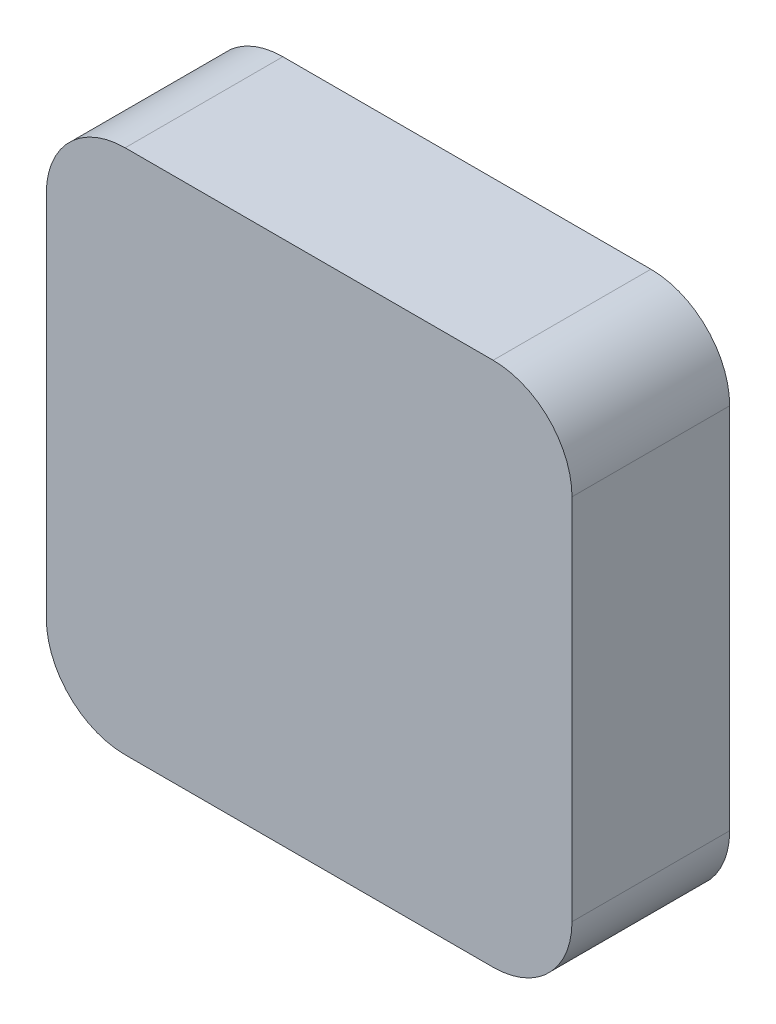
ISO-10303-21;
HEADER;
FILE_DESCRIPTION(('STEP AP214'),'2;1');
FILE_NAME('part.step','',(''),(''),'','','');
FILE_SCHEMA(('AUTOMOTIVE_DESIGN { 1 0 10303 214 1 1 1 1 }'));
ENDSEC;
DATA;
#1=APPLICATION_CONTEXT('core data for automotive mechanical design processes');
#2=APPLICATION_PROTOCOL_DEFINITION('international standard','automotive_design',2000,#1);
#3=PRODUCT_CONTEXT('',#1,'mechanical');
#4=PRODUCT('Part','Part','',(#3));
#5=PRODUCT_RELATED_PRODUCT_CATEGORY('part','',(#4));
#6=PRODUCT_DEFINITION_FORMATION('','',#4);
#7=PRODUCT_DEFINITION_CONTEXT('part definition',#1,'design');
#8=PRODUCT_DEFINITION('design','',#6,#7);
#9=PRODUCT_DEFINITION_SHAPE('','',#8);
#10=(LENGTH_UNIT() NAMED_UNIT(*) SI_UNIT(.MILLI.,.METRE.));
#11=(NAMED_UNIT(*) PLANE_ANGLE_UNIT() SI_UNIT($,.RADIAN.));
#12=(NAMED_UNIT(*) SI_UNIT($,.STERADIAN.) SOLID_ANGLE_UNIT());
#13=UNCERTAINTY_MEASURE_WITH_UNIT(LENGTH_MEASURE(1.E-05),#10,'distance_accuracy_value','');
#14=(GEOMETRIC_REPRESENTATION_CONTEXT(3) GLOBAL_UNCERTAINTY_ASSIGNED_CONTEXT((#13)) GLOBAL_UNIT_ASSIGNED_CONTEXT((#10,
#11,#12)) REPRESENTATION_CONTEXT('',''));
#15=CARTESIAN_POINT('',(0.,0.,0.));
#16=DIRECTION('',(0.,0.,1.));
#17=DIRECTION('',(1.,0.,0.));
#18=AXIS2_PLACEMENT_3D('',#15,#16,#17);
#19=CARTESIAN_POINT('',(-5.,-5.,1.2));
#20=DIRECTION('',(0.,0.,1.));
#21=DIRECTION('',(1.,0.,0.));
#22=AXIS2_PLACEMENT_3D('',#19,#20,#21);
#23=PLANE('',#22);
#24=DIRECTION('',(0.,1.,0.));
#25=VECTOR('',#24,1.);
#26=CARTESIAN_POINT('',(-5.,-5.,1.2));
#27=LINE('',#26,#25);
#28=CARTESIAN_POINT('',(-5.,-3.5,1.2));
#29=VERTEX_POINT('',#28);
#30=CARTESIAN_POINT('',(-5.,3.5,1.2));
#31=VERTEX_POINT('',#30);
#32=EDGE_CURVE('E9',#29,#31,#27,.T.);
#33=ORIENTED_EDGE('',*,*,#32,.F.);
#34=CARTESIAN_POINT('',(-3.5,-3.5,1.2));
#35=DIRECTION('',(0.,0.,1.));
#36=DIRECTION('',(0.,-1.,0.));
#37=AXIS2_PLACEMENT_3D('',#34,#35,#36);
#38=CIRCLE('',#37,1.5);
#39=CARTESIAN_POINT('',(-3.5,-5.,1.2));
#40=VERTEX_POINT('',#39);
#41=EDGE_CURVE('E41',#29,#40,#38,.T.);
#42=ORIENTED_EDGE('',*,*,#41,.T.);
#43=DIRECTION('',(1.,0.,0.));
#44=VECTOR('',#43,1.);
#45=CARTESIAN_POINT('',(-5.,-5.,1.2));
#46=LINE('',#45,#44);
#47=CARTESIAN_POINT('',(3.5,-5.,1.2));
#48=VERTEX_POINT('',#47);
#49=EDGE_CURVE('E466',#40,#48,#46,.T.);
#50=ORIENTED_EDGE('',*,*,#49,.T.);
#51=CARTESIAN_POINT('',(3.5,-3.5,1.2));
#52=DIRECTION('',(0.,0.,1.));
#53=DIRECTION('',(0.,-1.,0.));
#54=AXIS2_PLACEMENT_3D('',#51,#52,#53);
#55=CIRCLE('',#54,1.5);
#56=CARTESIAN_POINT('',(5.,-3.5,1.2));
#57=VERTEX_POINT('',#56);
#58=EDGE_CURVE('E442',#48,#57,#55,.T.);
#59=ORIENTED_EDGE('',*,*,#58,.T.);
#60=DIRECTION('',(0.,1.,0.));
#61=VECTOR('',#60,1.);
#62=CARTESIAN_POINT('',(5.,-5.,1.2));
#63=LINE('',#62,#61);
#64=CARTESIAN_POINT('',(5.,3.5,1.2));
#65=VERTEX_POINT('',#64);
#66=EDGE_CURVE('E570',#57,#65,#63,.T.);
#67=ORIENTED_EDGE('',*,*,#66,.T.);
#68=CARTESIAN_POINT('',(3.5,3.5,1.2));
#69=DIRECTION('',(0.,0.,-1.));
#70=DIRECTION('',(0.,1.,0.));
#71=AXIS2_PLACEMENT_3D('',#68,#69,#70);
#72=CIRCLE('',#71,1.5);
#73=CARTESIAN_POINT('',(3.5,5.,1.2));
#74=VERTEX_POINT('',#73);
#75=EDGE_CURVE('E621',#74,#65,#72,.T.);
#76=ORIENTED_EDGE('',*,*,#75,.F.);
#77=DIRECTION('',(1.,0.,0.));
#78=VECTOR('',#77,1.);
#79=CARTESIAN_POINT('',(-5.,5.,1.2));
#80=LINE('',#79,#78);
#81=CARTESIAN_POINT('',(-3.5,5.,1.2));
#82=VERTEX_POINT('',#81);
#83=EDGE_CURVE('E614',#82,#74,#80,.T.);
#84=ORIENTED_EDGE('',*,*,#83,.F.);
#85=CARTESIAN_POINT('',(-3.5,3.5,1.2));
#86=DIRECTION('',(0.,0.,-1.));
#87=DIRECTION('',(0.,1.,0.));
#88=AXIS2_PLACEMENT_3D('',#85,#86,#87);
#89=CIRCLE('',#88,1.5);
#90=EDGE_CURVE('E582',#31,#82,#89,.T.);
#91=ORIENTED_EDGE('',*,*,#90,.F.);
#92=EDGE_LOOP('',(#33,#42,#50,#59,#67,#76,#84,#91));
#93=FACE_BOUND('',#92,.T.);
#94=ADVANCED_FACE('F15',(#93),#23,.T.);
#95=CARTESIAN_POINT('',(-5.,-5.,0.));
#96=DIRECTION('',(1.,0.,0.));
#97=DIRECTION('',(0.,1.,0.));
#98=AXIS2_PLACEMENT_3D('',#95,#96,#97);
#99=PLANE('',#98);
#100=DIRECTION('',(0.,0.,1.));
#101=VECTOR('',#100,1.);
#102=CARTESIAN_POINT('',(-5.,-3.5,-1.8));
#103=LINE('',#102,#101);
#104=CARTESIAN_POINT('',(-5.,-3.5,-1.8));
#105=VERTEX_POINT('',#104);
#106=EDGE_CURVE('E24',#105,#29,#103,.T.);
#107=ORIENTED_EDGE('',*,*,#106,.T.);
#108=ORIENTED_EDGE('',*,*,#32,.T.);
#109=DIRECTION('',(0.,0.,-1.));
#110=VECTOR('',#109,1.);
#111=CARTESIAN_POINT('',(-5.,3.5,1.2));
#112=LINE('',#111,#110);
#113=CARTESIAN_POINT('',(-5.,3.5,-1.8));
#114=VERTEX_POINT('',#113);
#115=EDGE_CURVE('E611',#31,#114,#112,.T.);
#116=ORIENTED_EDGE('',*,*,#115,.T.);
#117=DIRECTION('',(0.,1.,0.));
#118=VECTOR('',#117,1.);
#119=CARTESIAN_POINT('',(-5.,-5.,-1.8));
#120=LINE('',#119,#118);
#121=EDGE_CURVE('E543',#105,#114,#120,.T.);
#122=ORIENTED_EDGE('',*,*,#121,.F.);
#123=EDGE_LOOP('',(#107,#108,#116,#122));
#124=FACE_BOUND('',#123,.T.);
#125=ADVANCED_FACE('F661',(#124),#99,.F.);
#126=CARTESIAN_POINT('',(-3.5,-3.5,-1.8));
#127=DIRECTION('',(0.,0.,1.));
#128=DIRECTION('',(-1.,0.,0.));
#129=AXIS2_PLACEMENT_3D('',#126,#127,#128);
#130=CYLINDRICAL_SURFACE('',#129,1.5);
#131=CARTESIAN_POINT('',(-3.5,-3.5,-1.8));
#132=DIRECTION('',(0.,0.,1.));
#133=DIRECTION('',(0.,-1.,0.));
#134=AXIS2_PLACEMENT_3D('',#131,#132,#133);
#135=CIRCLE('',#134,1.5);
#136=CARTESIAN_POINT('',(-3.5,-5.,-1.8));
#137=VERTEX_POINT('',#136);
#138=EDGE_CURVE('E494',#105,#137,#135,.T.);
#139=ORIENTED_EDGE('',*,*,#138,.T.);
#140=DIRECTION('',(0.,0.,1.));
#141=VECTOR('',#140,1.);
#142=CARTESIAN_POINT('',(-3.5,-5.,-1.8));
#143=LINE('',#142,#141);
#144=EDGE_CURVE('E344',#137,#40,#143,.T.);
#145=ORIENTED_EDGE('',*,*,#144,.T.);
#146=ORIENTED_EDGE('',*,*,#41,.F.);
#147=ORIENTED_EDGE('',*,*,#106,.F.);
#148=EDGE_LOOP('',(#139,#145,#146,#147));
#149=FACE_BOUND('',#148,.T.);
#150=ADVANCED_FACE('F17',(#149),#130,.T.);
#151=CARTESIAN_POINT('',(-5.,-5.,0.));
#152=DIRECTION('',(0.,1.,0.));
#153=DIRECTION('',(1.,0.,0.));
#154=AXIS2_PLACEMENT_3D('',#151,#152,#153);
#155=PLANE('',#154);
#156=DIRECTION('',(0.,0.,1.));
#157=VECTOR('',#156,1.);
#158=CARTESIAN_POINT('',(3.5,-5.,-1.8));
#159=LINE('',#158,#157);
#160=CARTESIAN_POINT('',(3.5,-5.,-1.8));
#161=VERTEX_POINT('',#160);
#162=EDGE_CURVE('E445',#161,#48,#159,.T.);
#163=ORIENTED_EDGE('',*,*,#162,.T.);
#164=ORIENTED_EDGE('',*,*,#49,.F.);
#165=ORIENTED_EDGE('',*,*,#144,.F.);
#166=DIRECTION('',(1.,0.,0.));
#167=VECTOR('',#166,1.);
#168=CARTESIAN_POINT('',(-5.,-5.,-1.8));
#169=LINE('',#168,#167);
#170=EDGE_CURVE('E490',#137,#161,#169,.T.);
#171=ORIENTED_EDGE('',*,*,#170,.T.);
#172=EDGE_LOOP('',(#163,#164,#165,#171));
#173=FACE_BOUND('',#172,.T.);
#174=ADVANCED_FACE('F637',(#173),#155,.F.);
#175=CARTESIAN_POINT('',(3.5,-3.5,-1.8));
#176=DIRECTION('',(0.,0.,1.));
#177=DIRECTION('',(0.,-1.,0.));
#178=AXIS2_PLACEMENT_3D('',#175,#176,#177);
#179=CYLINDRICAL_SURFACE('',#178,1.5);
#180=CARTESIAN_POINT('',(3.5,-3.5,-1.8));
#181=DIRECTION('',(0.,0.,1.));
#182=DIRECTION('',(0.,-1.,0.));
#183=AXIS2_PLACEMENT_3D('',#180,#181,#182);
#184=CIRCLE('',#183,1.5);
#185=CARTESIAN_POINT('',(5.,-3.5,-1.8));
#186=VERTEX_POINT('',#185);
#187=EDGE_CURVE('E358',#161,#186,#184,.T.);
#188=ORIENTED_EDGE('',*,*,#187,.T.);
#189=DIRECTION('',(0.,0.,1.));
#190=VECTOR('',#189,1.);
#191=CARTESIAN_POINT('',(5.,-3.5,-1.8));
#192=LINE('',#191,#190);
#193=EDGE_CURVE('E446',#186,#57,#192,.T.);
#194=ORIENTED_EDGE('',*,*,#193,.T.);
#195=ORIENTED_EDGE('',*,*,#58,.F.);
#196=ORIENTED_EDGE('',*,*,#162,.F.);
#197=EDGE_LOOP('',(#188,#194,#195,#196));
#198=FACE_BOUND('',#197,.T.);
#199=ADVANCED_FACE('F641',(#198),#179,.T.);
#200=CARTESIAN_POINT('',(5.,-5.,0.));
#201=DIRECTION('',(1.,0.,0.));
#202=DIRECTION('',(0.,1.,0.));
#203=AXIS2_PLACEMENT_3D('',#200,#201,#202);
#204=PLANE('',#203);
#205=DIRECTION('',(0.,1.,0.));
#206=VECTOR('',#205,1.);
#207=CARTESIAN_POINT('',(5.,-5.,-1.8));
#208=LINE('',#207,#206);
#209=CARTESIAN_POINT('',(5.,3.5,-1.8));
#210=VERTEX_POINT('',#209);
#211=EDGE_CURVE('E354',#186,#210,#208,.T.);
#212=ORIENTED_EDGE('',*,*,#211,.T.);
#213=DIRECTION('',(0.,0.,-1.));
#214=VECTOR('',#213,1.);
#215=CARTESIAN_POINT('',(5.,3.5,1.2));
#216=LINE('',#215,#214);
#217=EDGE_CURVE('E573',#65,#210,#216,.T.);
#218=ORIENTED_EDGE('',*,*,#217,.F.);
#219=ORIENTED_EDGE('',*,*,#66,.F.);
#220=ORIENTED_EDGE('',*,*,#193,.F.);
#221=EDGE_LOOP('',(#212,#218,#219,#220));
#222=FACE_BOUND('',#221,.T.);
#223=ADVANCED_FACE('F646',(#222),#204,.T.);
#224=CARTESIAN_POINT('',(3.5,3.5,1.2));
#225=DIRECTION('',(0.,0.,-1.));
#226=DIRECTION('',(0.,1.,0.));
#227=AXIS2_PLACEMENT_3D('',#224,#225,#226);
#228=CYLINDRICAL_SURFACE('',#227,1.5);
#229=ORIENTED_EDGE('',*,*,#75,.T.);
#230=ORIENTED_EDGE('',*,*,#217,.T.);
#231=CARTESIAN_POINT('',(3.5,3.5,-1.8));
#232=DIRECTION('',(0.,0.,-1.));
#233=DIRECTION('',(0.,1.,0.));
#234=AXIS2_PLACEMENT_3D('',#231,#232,#233);
#235=CIRCLE('',#234,1.5);
#236=CARTESIAN_POINT('',(3.5,5.,-1.8));
#237=VERTEX_POINT('',#236);
#238=EDGE_CURVE('E359',#237,#210,#235,.T.);
#239=ORIENTED_EDGE('',*,*,#238,.F.);
#240=DIRECTION('',(0.,0.,-1.));
#241=VECTOR('',#240,1.);
#242=CARTESIAN_POINT('',(3.5,5.,1.2));
#243=LINE('',#242,#241);
#244=EDGE_CURVE('E618',#74,#237,#243,.T.);
#245=ORIENTED_EDGE('',*,*,#244,.F.);
#246=EDGE_LOOP('',(#229,#230,#239,#245));
#247=FACE_BOUND('',#246,.T.);
#248=ADVANCED_FACE('F651',(#247),#228,.T.);
#249=CARTESIAN_POINT('',(-5.,5.,0.));
#250=DIRECTION('',(0.,1.,0.));
#251=DIRECTION('',(1.,0.,0.));
#252=AXIS2_PLACEMENT_3D('',#249,#250,#251);
#253=PLANE('',#252);
#254=DIRECTION('',(1.,0.,0.));
#255=VECTOR('',#254,1.);
#256=CARTESIAN_POINT('',(-5.,5.,-1.8));
#257=LINE('',#256,#255);
#258=CARTESIAN_POINT('',(-3.5,5.,-1.8));
#259=VERTEX_POINT('',#258);
#260=EDGE_CURVE('E450',#259,#237,#257,.T.);
#261=ORIENTED_EDGE('',*,*,#260,.F.);
#262=DIRECTION('',(0.,0.,-1.));
#263=VECTOR('',#262,1.);
#264=CARTESIAN_POINT('',(-3.5,5.,1.2));
#265=LINE('',#264,#263);
#266=EDGE_CURVE('E608',#82,#259,#265,.T.);
#267=ORIENTED_EDGE('',*,*,#266,.F.);
#268=ORIENTED_EDGE('',*,*,#83,.T.);
#269=ORIENTED_EDGE('',*,*,#244,.T.);
#270=EDGE_LOOP('',(#261,#267,#268,#269));
#271=FACE_BOUND('',#270,.T.);
#272=ADVANCED_FACE('F654',(#271),#253,.T.);
#273=CARTESIAN_POINT('',(-3.5,3.5,1.2));
#274=DIRECTION('',(0.,0.,-1.));
#275=DIRECTION('',(-1.,0.,0.));
#276=AXIS2_PLACEMENT_3D('',#273,#274,#275);
#277=CYLINDRICAL_SURFACE('',#276,1.5);
#278=ORIENTED_EDGE('',*,*,#90,.T.);
#279=ORIENTED_EDGE('',*,*,#266,.T.);
#280=CARTESIAN_POINT('',(-3.5,3.5,-1.8));
#281=DIRECTION('',(0.,0.,-1.));
#282=DIRECTION('',(0.,1.,0.));
#283=AXIS2_PLACEMENT_3D('',#280,#281,#282);
#284=CIRCLE('',#283,1.5);
#285=EDGE_CURVE('E454',#114,#259,#284,.T.);
#286=ORIENTED_EDGE('',*,*,#285,.F.);
#287=ORIENTED_EDGE('',*,*,#115,.F.);
#288=EDGE_LOOP('',(#278,#279,#286,#287));
#289=FACE_BOUND('',#288,.T.);
#290=ADVANCED_FACE('F658',(#289),#277,.T.);
#291=CARTESIAN_POINT('',(-0.9,-2.62,-1.8));
#292=DIRECTION('',(0.,0.,1.));
#293=DIRECTION('',(1.,0.,0.));
#294=AXIS2_PLACEMENT_3D('',#291,#292,#293);
#295=PLANE('',#294);
#296=DIRECTION('',(1.,0.,0.));
#297=VECTOR('',#296,1.);
#298=CARTESIAN_POINT('',(-0.9,-1.92,-1.8));
#299=LINE('',#298,#297);
#300=CARTESIAN_POINT('',(-0.9,-1.92,-1.8));
#301=VERTEX_POINT('',#300);
#302=CARTESIAN_POINT('',(0.9,-1.92,-1.8));
#303=VERTEX_POINT('',#302);
#304=EDGE_CURVE('E428',#301,#303,#299,.T.);
#305=ORIENTED_EDGE('',*,*,#304,.T.);
#306=DIRECTION('',(0.,1.,0.));
#307=VECTOR('',#306,1.);
#308=CARTESIAN_POINT('',(0.9,-2.62,-1.8));
#309=LINE('',#308,#307);
#310=CARTESIAN_POINT('',(0.9,-2.62,-1.8));
#311=VERTEX_POINT('',#310);
#312=EDGE_CURVE('E518',#311,#303,#309,.T.);
#313=ORIENTED_EDGE('',*,*,#312,.F.);
#314=DIRECTION('',(1.,0.,0.));
#315=VECTOR('',#314,1.);
#316=CARTESIAN_POINT('',(-0.9,-2.62,-1.8));
#317=LINE('',#316,#315);
#318=CARTESIAN_POINT('',(-0.9,-2.62,-1.8));
#319=VERTEX_POINT('',#318);
#320=EDGE_CURVE('E509',#319,#311,#317,.T.);
#321=ORIENTED_EDGE('',*,*,#320,.F.);
#322=DIRECTION('',(0.,1.,0.));
#323=VECTOR('',#322,1.);
#324=CARTESIAN_POINT('',(-0.9,-2.62,-1.8));
#325=LINE('',#324,#323);
#326=EDGE_CURVE('E427',#319,#301,#325,.T.);
#327=ORIENTED_EDGE('',*,*,#326,.T.);
#328=EDGE_LOOP('',(#305,#313,#321,#327));
#329=FACE_BOUND('',#328,.T.);
#330=ADVANCED_FACE('F773',(#329),#295,.F.);
#331=CARTESIAN_POINT('',(-2.62,-2.4,-1.8));
#332=DIRECTION('',(0.,0.,1.));
#333=DIRECTION('',(1.,0.,0.));
#334=AXIS2_PLACEMENT_3D('',#331,#332,#333);
#335=PLANE('',#334);
#336=DIRECTION('',(1.,0.,0.));
#337=VECTOR('',#336,1.);
#338=CARTESIAN_POINT('',(-2.62,2.4,-1.8));
#339=LINE('',#338,#337);
#340=CARTESIAN_POINT('',(-2.62,2.4,-1.8));
#341=VERTEX_POINT('',#340);
#342=CARTESIAN_POINT('',(-1.92,2.4,-1.8));
#343=VERTEX_POINT('',#342);
#344=EDGE_CURVE('E387',#341,#343,#339,.T.);
#345=ORIENTED_EDGE('',*,*,#344,.T.);
#346=DIRECTION('',(0.,1.,0.));
#347=VECTOR('',#346,1.);
#348=CARTESIAN_POINT('',(-1.92,-2.4,-1.8));
#349=LINE('',#348,#347);
#350=CARTESIAN_POINT('',(-1.92,-2.4,-1.8));
#351=VERTEX_POINT('',#350);
#352=EDGE_CURVE('E388',#351,#343,#349,.T.);
#353=ORIENTED_EDGE('',*,*,#352,.F.);
#354=DIRECTION('',(1.,0.,0.));
#355=VECTOR('',#354,1.);
#356=CARTESIAN_POINT('',(-2.62,-2.4,-1.8));
#357=LINE('',#356,#355);
#358=CARTESIAN_POINT('',(-2.62,-2.4,-1.8));
#359=VERTEX_POINT('',#358);
#360=EDGE_CURVE('E558',#359,#351,#357,.T.);
#361=ORIENTED_EDGE('',*,*,#360,.F.);
#362=DIRECTION('',(0.,1.,0.));
#363=VECTOR('',#362,1.);
#364=CARTESIAN_POINT('',(-2.62,-2.4,-1.8));
#365=LINE('',#364,#363);
#366=EDGE_CURVE('E476',#359,#341,#365,.T.);
#367=ORIENTED_EDGE('',*,*,#366,.T.);
#368=EDGE_LOOP('',(#345,#353,#361,#367));
#369=FACE_BOUND('',#368,.T.);
#370=ADVANCED_FACE('F731',(#369),#335,.F.);
#371=CARTESIAN_POINT('',(1.92,-2.4,-1.8));
#372=DIRECTION('',(0.,0.,1.));
#373=DIRECTION('',(1.,0.,0.));
#374=AXIS2_PLACEMENT_3D('',#371,#372,#373);
#375=PLANE('',#374);
#376=DIRECTION('',(1.,0.,0.));
#377=VECTOR('',#376,1.);
#378=CARTESIAN_POINT('',(1.92,2.4,-1.8));
#379=LINE('',#378,#377);
#380=CARTESIAN_POINT('',(1.92,2.4,-1.8));
#381=VERTEX_POINT('',#380);
#382=CARTESIAN_POINT('',(2.62,2.4,-1.8));
#383=VERTEX_POINT('',#382);
#384=EDGE_CURVE('E585',#381,#383,#379,.T.);
#385=ORIENTED_EDGE('',*,*,#384,.T.);
#386=DIRECTION('',(0.,1.,0.));
#387=VECTOR('',#386,1.);
#388=CARTESIAN_POINT('',(2.62,-2.4,-1.8));
#389=LINE('',#388,#387);
#390=CARTESIAN_POINT('',(2.62,-2.4,-1.8));
#391=VERTEX_POINT('',#390);
#392=EDGE_CURVE('E574',#391,#383,#389,.T.);
#393=ORIENTED_EDGE('',*,*,#392,.F.);
#394=DIRECTION('',(1.,0.,0.));
#395=VECTOR('',#394,1.);
#396=CARTESIAN_POINT('',(1.92,-2.4,-1.8));
#397=LINE('',#396,#395);
#398=CARTESIAN_POINT('',(1.92,-2.4,-1.8));
#399=VERTEX_POINT('',#398);
#400=EDGE_CURVE('E569',#399,#391,#397,.T.);
#401=ORIENTED_EDGE('',*,*,#400,.F.);
#402=DIRECTION('',(0.,1.,0.));
#403=VECTOR('',#402,1.);
#404=CARTESIAN_POINT('',(1.92,-2.4,-1.8));
#405=LINE('',#404,#403);
#406=EDGE_CURVE('E410',#399,#381,#405,.T.);
#407=ORIENTED_EDGE('',*,*,#406,.T.);
#408=EDGE_LOOP('',(#385,#393,#401,#407));
#409=FACE_BOUND('',#408,.T.);
#410=ADVANCED_FACE('F728',(#409),#375,.F.);
#411=CARTESIAN_POINT('',(-0.9,1.92,-1.8));
#412=DIRECTION('',(0.,0.,1.));
#413=DIRECTION('',(1.,0.,0.));
#414=AXIS2_PLACEMENT_3D('',#411,#412,#413);
#415=PLANE('',#414);
#416=DIRECTION('',(1.,0.,0.));
#417=VECTOR('',#416,1.);
#418=CARTESIAN_POINT('',(-0.9,2.62,-1.8));
#419=LINE('',#418,#417);
#420=CARTESIAN_POINT('',(-0.9,2.62,-1.8));
#421=VERTEX_POINT('',#420);
#422=CARTESIAN_POINT('',(0.9,2.62,-1.8));
#423=VERTEX_POINT('',#422);
#424=EDGE_CURVE('E546',#421,#423,#419,.T.);
#425=ORIENTED_EDGE('',*,*,#424,.T.);
#426=DIRECTION('',(0.,1.,0.));
#427=VECTOR('',#426,1.);
#428=CARTESIAN_POINT('',(0.9,1.92,-1.8));
#429=LINE('',#428,#427);
#430=CARTESIAN_POINT('',(0.9,1.92,-1.8));
#431=VERTEX_POINT('',#430);
#432=EDGE_CURVE('E527',#431,#423,#429,.T.);
#433=ORIENTED_EDGE('',*,*,#432,.F.);
#434=DIRECTION('',(1.,0.,0.));
#435=VECTOR('',#434,1.);
#436=CARTESIAN_POINT('',(-0.9,1.92,-1.8));
#437=LINE('',#436,#435);
#438=CARTESIAN_POINT('',(-0.9,1.92,-1.8));
#439=VERTEX_POINT('',#438);
#440=EDGE_CURVE('E523',#439,#431,#437,.T.);
#441=ORIENTED_EDGE('',*,*,#440,.F.);
#442=DIRECTION('',(0.,1.,0.));
#443=VECTOR('',#442,1.);
#444=CARTESIAN_POINT('',(-0.9,1.92,-1.8));
#445=LINE('',#444,#443);
#446=EDGE_CURVE('E554',#439,#421,#445,.T.);
#447=ORIENTED_EDGE('',*,*,#446,.T.);
#448=EDGE_LOOP('',(#425,#433,#441,#447));
#449=FACE_BOUND('',#448,.T.);
#450=ADVANCED_FACE('F697',(#449),#415,.F.);
#451=CARTESIAN_POINT('',(-5.,-5.,-1.8));
#452=DIRECTION('',(0.,0.,1.));
#453=DIRECTION('',(1.,0.,0.));
#454=AXIS2_PLACEMENT_3D('',#451,#452,#453);
#455=PLANE('',#454);
#456=ORIENTED_EDGE('',*,*,#285,.T.);
#457=ORIENTED_EDGE('',*,*,#260,.T.);
#458=ORIENTED_EDGE('',*,*,#238,.T.);
#459=ORIENTED_EDGE('',*,*,#211,.F.);
#460=ORIENTED_EDGE('',*,*,#187,.F.);
#461=ORIENTED_EDGE('',*,*,#170,.F.);
#462=ORIENTED_EDGE('',*,*,#138,.F.);
#463=ORIENTED_EDGE('',*,*,#121,.T.);
#464=EDGE_LOOP('',(#456,#457,#458,#459,#460,#461,#462,#463));
#465=FACE_BOUND('',#464,.T.);
#466=CARTESIAN_POINT('',(2.7,2.7,-1.8));
#467=DIRECTION('',(0.,0.,1.));
#468=DIRECTION('',(0.,-1.,0.));
#469=AXIS2_PLACEMENT_3D('',#466,#467,#468);
#470=CIRCLE('',#469,1.5);
#471=CARTESIAN_POINT('',(4.2,2.7,-1.8));
#472=VERTEX_POINT('',#471);
#473=CARTESIAN_POINT('',(2.7,4.2,-1.8));
#474=VERTEX_POINT('',#473);
#475=EDGE_CURVE('E512',#472,#474,#470,.T.);
#476=ORIENTED_EDGE('',*,*,#475,.T.);
#477=DIRECTION('',(-1.,0.,0.));
#478=VECTOR('',#477,1.);
#479=CARTESIAN_POINT('',(-4.6,4.2,-1.8));
#480=LINE('',#479,#478);
#481=CARTESIAN_POINT('',(-2.7,4.2,-1.8));
#482=VERTEX_POINT('',#481);
#483=EDGE_CURVE('E332',#474,#482,#480,.T.);
#484=ORIENTED_EDGE('',*,*,#483,.T.);
#485=CARTESIAN_POINT('',(-2.7,2.7,-1.8));
#486=DIRECTION('',(0.,0.,1.));
#487=DIRECTION('',(0.,-1.,0.));
#488=AXIS2_PLACEMENT_3D('',#485,#486,#487);
#489=CIRCLE('',#488,1.5);
#490=CARTESIAN_POINT('',(-4.2,2.7,-1.8));
#491=VERTEX_POINT('',#490);
#492=EDGE_CURVE('E486',#482,#491,#489,.T.);
#493=ORIENTED_EDGE('',*,*,#492,.T.);
#494=DIRECTION('',(0.,1.,0.));
#495=VECTOR('',#494,1.);
#496=CARTESIAN_POINT('',(-4.2,-4.6,-1.8));
#497=LINE('',#496,#495);
#498=CARTESIAN_POINT('',(-4.2,-2.7,-1.8));
#499=VERTEX_POINT('',#498);
#500=EDGE_CURVE('E415',#499,#491,#497,.T.);
#501=ORIENTED_EDGE('',*,*,#500,.F.);
#502=CARTESIAN_POINT('',(-2.7,-2.7,-1.8));
#503=DIRECTION('',(0.,0.,1.));
#504=DIRECTION('',(0.,-1.,0.));
#505=AXIS2_PLACEMENT_3D('',#502,#503,#504);
#506=CIRCLE('',#505,1.5);
#507=CARTESIAN_POINT('',(-2.7,-4.2,-1.8));
#508=VERTEX_POINT('',#507);
#509=EDGE_CURVE('E475',#499,#508,#506,.T.);
#510=ORIENTED_EDGE('',*,*,#509,.T.);
#511=DIRECTION('',(-1.,0.,0.));
#512=VECTOR('',#511,1.);
#513=CARTESIAN_POINT('',(-4.6,-4.2,-1.8));
#514=LINE('',#513,#512);
#515=CARTESIAN_POINT('',(2.7,-4.2,-1.8));
#516=VERTEX_POINT('',#515);
#517=EDGE_CURVE('E489',#516,#508,#514,.T.);
#518=ORIENTED_EDGE('',*,*,#517,.F.);
#519=CARTESIAN_POINT('',(2.7,-2.7,-1.8));
#520=DIRECTION('',(0.,0.,-1.));
#521=DIRECTION('',(0.,-1.,0.));
#522=AXIS2_PLACEMENT_3D('',#519,#520,#521);
#523=CIRCLE('',#522,1.5);
#524=CARTESIAN_POINT('',(4.2,-2.7,-1.8));
#525=VERTEX_POINT('',#524);
#526=EDGE_CURVE('E304',#525,#516,#523,.T.);
#527=ORIENTED_EDGE('',*,*,#526,.F.);
#528=DIRECTION('',(0.,1.,0.));
#529=VECTOR('',#528,1.);
#530=CARTESIAN_POINT('',(4.2,-4.6,-1.8));
#531=LINE('',#530,#529);
#532=EDGE_CURVE('E299',#525,#472,#531,.T.);
#533=ORIENTED_EDGE('',*,*,#532,.T.);
#534=EDGE_LOOP('',(#476,#484,#493,#501,#510,#518,#527,#533));
#535=FACE_BOUND('',#534,.T.);
#536=ADVANCED_FACE('F664',(#465,#535),#455,.F.);
#537=CARTESIAN_POINT('',(-0.9,-2.62,-1.8));
#538=DIRECTION('',(1.,0.,0.));
#539=DIRECTION('',(0.,1.,0.));
#540=AXIS2_PLACEMENT_3D('',#537,#538,#539);
#541=PLANE('',#540);
#542=DIRECTION('',(0.,1.,0.));
#543=VECTOR('',#542,1.);
#544=CARTESIAN_POINT('',(-0.9,-2.62,0.));
#545=LINE('',#544,#543);
#546=CARTESIAN_POINT('',(-0.9,-2.62,0.));
#547=VERTEX_POINT('',#546);
#548=CARTESIAN_POINT('',(-0.9,-1.92,0.));
#549=VERTEX_POINT('',#548);
#550=EDGE_CURVE('E420',#547,#549,#545,.T.);
#551=ORIENTED_EDGE('',*,*,#550,.T.);
#552=DIRECTION('',(0.,0.,1.));
#553=VECTOR('',#552,1.);
#554=CARTESIAN_POINT('',(-0.9,-1.92,-1.8));
#555=LINE('',#554,#553);
#556=EDGE_CURVE('E424',#301,#549,#555,.T.);
#557=ORIENTED_EDGE('',*,*,#556,.F.);
#558=ORIENTED_EDGE('',*,*,#326,.F.);
#559=DIRECTION('',(0.,0.,1.));
#560=VECTOR('',#559,1.);
#561=CARTESIAN_POINT('',(-0.9,-2.62,-1.8));
#562=LINE('',#561,#560);
#563=EDGE_CURVE('E506',#319,#547,#562,.T.);
#564=ORIENTED_EDGE('',*,*,#563,.T.);
#565=EDGE_LOOP('',(#551,#557,#558,#564));
#566=FACE_BOUND('',#565,.T.);
#567=ADVANCED_FACE('F696',(#566),#541,.F.);
#568=CARTESIAN_POINT('',(-0.9,-1.92,-1.8));
#569=DIRECTION('',(0.,1.,0.));
#570=DIRECTION('',(1.,0.,0.));
#571=AXIS2_PLACEMENT_3D('',#568,#569,#570);
#572=PLANE('',#571);
#573=ORIENTED_EDGE('',*,*,#304,.F.);
#574=ORIENTED_EDGE('',*,*,#556,.T.);
#575=DIRECTION('',(1.,0.,0.));
#576=VECTOR('',#575,1.);
#577=CARTESIAN_POINT('',(-0.9,-1.92,0.));
#578=LINE('',#577,#576);
#579=CARTESIAN_POINT('',(0.9,-1.92,0.));
#580=VERTEX_POINT('',#579);
#581=EDGE_CURVE('E438',#549,#580,#578,.T.);
#582=ORIENTED_EDGE('',*,*,#581,.T.);
#583=DIRECTION('',(0.,0.,1.));
#584=VECTOR('',#583,1.);
#585=CARTESIAN_POINT('',(0.9,-1.92,-1.8));
#586=LINE('',#585,#584);
#587=EDGE_CURVE('E522',#303,#580,#586,.T.);
#588=ORIENTED_EDGE('',*,*,#587,.F.);
#589=EDGE_LOOP('',(#573,#574,#582,#588));
#590=FACE_BOUND('',#589,.T.);
#591=ADVANCED_FACE('F763',(#590),#572,.T.);
#592=CARTESIAN_POINT('',(0.9,-2.62,-1.8));
#593=DIRECTION('',(1.,0.,0.));
#594=DIRECTION('',(0.,1.,0.));
#595=AXIS2_PLACEMENT_3D('',#592,#593,#594);
#596=PLANE('',#595);
#597=DIRECTION('',(0.,0.,1.));
#598=VECTOR('',#597,1.);
#599=CARTESIAN_POINT('',(0.9,-2.62,-1.8));
#600=LINE('',#599,#598);
#601=CARTESIAN_POINT('',(0.9,-2.62,0.));
#602=VERTEX_POINT('',#601);
#603=EDGE_CURVE('E479',#311,#602,#600,.T.);
#604=ORIENTED_EDGE('',*,*,#603,.F.);
#605=ORIENTED_EDGE('',*,*,#312,.T.);
#606=ORIENTED_EDGE('',*,*,#587,.T.);
#607=DIRECTION('',(0.,1.,0.));
#608=VECTOR('',#607,1.);
#609=CARTESIAN_POINT('',(0.9,-2.62,0.));
#610=LINE('',#609,#608);
#611=EDGE_CURVE('E403',#602,#580,#610,.T.);
#612=ORIENTED_EDGE('',*,*,#611,.F.);
#613=EDGE_LOOP('',(#604,#605,#606,#612));
#614=FACE_BOUND('',#613,.T.);
#615=ADVANCED_FACE('F759',(#614),#596,.T.);
#616=CARTESIAN_POINT('',(-0.9,-2.62,-1.8));
#617=DIRECTION('',(0.,1.,0.));
#618=DIRECTION('',(1.,0.,0.));
#619=AXIS2_PLACEMENT_3D('',#616,#617,#618);
#620=PLANE('',#619);
#621=ORIENTED_EDGE('',*,*,#603,.T.);
#622=DIRECTION('',(1.,0.,0.));
#623=VECTOR('',#622,1.);
#624=CARTESIAN_POINT('',(-0.9,-2.62,0.));
#625=LINE('',#624,#623);
#626=EDGE_CURVE('E399',#547,#602,#625,.T.);
#627=ORIENTED_EDGE('',*,*,#626,.F.);
#628=ORIENTED_EDGE('',*,*,#563,.F.);
#629=ORIENTED_EDGE('',*,*,#320,.T.);
#630=EDGE_LOOP('',(#621,#627,#628,#629));
#631=FACE_BOUND('',#630,.T.);
#632=ADVANCED_FACE('F755',(#631),#620,.F.);
#633=CARTESIAN_POINT('',(-2.62,-2.4,-1.8));
#634=DIRECTION('',(1.,0.,0.));
#635=DIRECTION('',(0.,1.,0.));
#636=AXIS2_PLACEMENT_3D('',#633,#634,#635);
#637=PLANE('',#636);
#638=DIRECTION('',(0.,1.,0.));
#639=VECTOR('',#638,1.);
#640=CARTESIAN_POINT('',(-2.62,-2.4,0.));
#641=LINE('',#640,#639);
#642=CARTESIAN_POINT('',(-2.62,-2.4,0.));
#643=VERTEX_POINT('',#642);
#644=CARTESIAN_POINT('',(-2.62,2.4,0.));
#645=VERTEX_POINT('',#644);
#646=EDGE_CURVE('E393',#643,#645,#641,.T.);
#647=ORIENTED_EDGE('',*,*,#646,.T.);
#648=DIRECTION('',(0.,0.,1.));
#649=VECTOR('',#648,1.);
#650=CARTESIAN_POINT('',(-2.62,2.4,-1.8));
#651=LINE('',#650,#649);
#652=EDGE_CURVE('E460',#341,#645,#651,.T.);
#653=ORIENTED_EDGE('',*,*,#652,.F.);
#654=ORIENTED_EDGE('',*,*,#366,.F.);
#655=DIRECTION('',(0.,0.,1.));
#656=VECTOR('',#655,1.);
#657=CARTESIAN_POINT('',(-2.62,-2.4,-1.8));
#658=LINE('',#657,#656);
#659=EDGE_CURVE('E594',#359,#643,#658,.T.);
#660=ORIENTED_EDGE('',*,*,#659,.T.);
#661=EDGE_LOOP('',(#647,#653,#654,#660));
#662=FACE_BOUND('',#661,.T.);
#663=ADVANCED_FACE('F751',(#662),#637,.F.);
#664=CARTESIAN_POINT('',(-2.62,2.4,-1.8));
#665=DIRECTION('',(0.,1.,0.));
#666=DIRECTION('',(1.,0.,0.));
#667=AXIS2_PLACEMENT_3D('',#664,#665,#666);
#668=PLANE('',#667);
#669=ORIENTED_EDGE('',*,*,#344,.F.);
#670=ORIENTED_EDGE('',*,*,#652,.T.);
#671=DIRECTION('',(1.,0.,0.));
#672=VECTOR('',#671,1.);
#673=CARTESIAN_POINT('',(-2.62,2.4,0.));
#674=LINE('',#673,#672);
#675=CARTESIAN_POINT('',(-1.92,2.4,0.));
#676=VERTEX_POINT('',#675);
#677=EDGE_CURVE('E389',#645,#676,#674,.T.);
#678=ORIENTED_EDGE('',*,*,#677,.T.);
#679=DIRECTION('',(0.,0.,1.));
#680=VECTOR('',#679,1.);
#681=CARTESIAN_POINT('',(-1.92,2.4,-1.8));
#682=LINE('',#681,#680);
#683=EDGE_CURVE('E384',#343,#676,#682,.T.);
#684=ORIENTED_EDGE('',*,*,#683,.F.);
#685=EDGE_LOOP('',(#669,#670,#678,#684));
#686=FACE_BOUND('',#685,.T.);
#687=ADVANCED_FACE('F747',(#686),#668,.T.);
#688=CARTESIAN_POINT('',(-1.92,-2.4,-1.8));
#689=DIRECTION('',(1.,0.,0.));
#690=DIRECTION('',(0.,1.,0.));
#691=AXIS2_PLACEMENT_3D('',#688,#689,#690);
#692=PLANE('',#691);
#693=DIRECTION('',(0.,0.,1.));
#694=VECTOR('',#693,1.);
#695=CARTESIAN_POINT('',(-1.92,-2.4,-1.8));
#696=LINE('',#695,#694);
#697=CARTESIAN_POINT('',(-1.92,-2.4,0.));
#698=VERTEX_POINT('',#697);
#699=EDGE_CURVE('E413',#351,#698,#696,.T.);
#700=ORIENTED_EDGE('',*,*,#699,.F.);
#701=ORIENTED_EDGE('',*,*,#352,.T.);
#702=ORIENTED_EDGE('',*,*,#683,.T.);
#703=DIRECTION('',(0.,1.,0.));
#704=VECTOR('',#703,1.);
#705=CARTESIAN_POINT('',(-1.92,-2.4,0.));
#706=LINE('',#705,#704);
#707=EDGE_CURVE('E394',#698,#676,#706,.T.);
#708=ORIENTED_EDGE('',*,*,#707,.F.);
#709=EDGE_LOOP('',(#700,#701,#702,#708));
#710=FACE_BOUND('',#709,.T.);
#711=ADVANCED_FACE('F743',(#710),#692,.T.);
#712=CARTESIAN_POINT('',(-2.62,-2.4,-1.8));
#713=DIRECTION('',(0.,1.,0.));
#714=DIRECTION('',(1.,0.,0.));
#715=AXIS2_PLACEMENT_3D('',#712,#713,#714);
#716=PLANE('',#715);
#717=ORIENTED_EDGE('',*,*,#699,.T.);
#718=DIRECTION('',(1.,0.,0.));
#719=VECTOR('',#718,1.);
#720=CARTESIAN_POINT('',(-2.62,-2.4,0.));
#721=LINE('',#720,#719);
#722=EDGE_CURVE('E348',#643,#698,#721,.T.);
#723=ORIENTED_EDGE('',*,*,#722,.F.);
#724=ORIENTED_EDGE('',*,*,#659,.F.);
#725=ORIENTED_EDGE('',*,*,#360,.T.);
#726=EDGE_LOOP('',(#717,#723,#724,#725));
#727=FACE_BOUND('',#726,.T.);
#728=ADVANCED_FACE('F746',(#727),#716,.F.);
#729=CARTESIAN_POINT('',(1.92,-2.4,-1.8));
#730=DIRECTION('',(1.,0.,0.));
#731=DIRECTION('',(0.,1.,0.));
#732=AXIS2_PLACEMENT_3D('',#729,#730,#731);
#733=PLANE('',#732);
#734=DIRECTION('',(0.,1.,0.));
#735=VECTOR('',#734,1.);
#736=CARTESIAN_POINT('',(1.92,-2.4,0.));
#737=LINE('',#736,#735);
#738=CARTESIAN_POINT('',(1.92,-2.4,0.));
#739=VERTEX_POINT('',#738);
#740=CARTESIAN_POINT('',(1.92,2.4,0.));
#741=VERTEX_POINT('',#740);
#742=EDGE_CURVE('E345',#739,#741,#737,.T.);
#743=ORIENTED_EDGE('',*,*,#742,.T.);
#744=DIRECTION('',(0.,0.,1.));
#745=VECTOR('',#744,1.);
#746=CARTESIAN_POINT('',(1.92,2.4,-1.8));
#747=LINE('',#746,#745);
#748=EDGE_CURVE('E414',#381,#741,#747,.T.);
#749=ORIENTED_EDGE('',*,*,#748,.F.);
#750=ORIENTED_EDGE('',*,*,#406,.F.);
#751=DIRECTION('',(0.,0.,1.));
#752=VECTOR('',#751,1.);
#753=CARTESIAN_POINT('',(1.92,-2.4,-1.8));
#754=LINE('',#753,#752);
#755=EDGE_CURVE('E566',#399,#739,#754,.T.);
#756=ORIENTED_EDGE('',*,*,#755,.T.);
#757=EDGE_LOOP('',(#743,#749,#750,#756));
#758=FACE_BOUND('',#757,.T.);
#759=ADVANCED_FACE('F741',(#758),#733,.F.);
#760=CARTESIAN_POINT('',(1.92,2.4,-1.8));
#761=DIRECTION('',(0.,1.,0.));
#762=DIRECTION('',(1.,0.,0.));
#763=AXIS2_PLACEMENT_3D('',#760,#761,#762);
#764=PLANE('',#763);
#765=ORIENTED_EDGE('',*,*,#384,.F.);
#766=ORIENTED_EDGE('',*,*,#748,.T.);
#767=DIRECTION('',(1.,0.,0.));
#768=VECTOR('',#767,1.);
#769=CARTESIAN_POINT('',(1.92,2.4,0.));
#770=LINE('',#769,#768);
#771=CARTESIAN_POINT('',(2.62,2.4,0.));
#772=VERTEX_POINT('',#771);
#773=EDGE_CURVE('E349',#741,#772,#770,.T.);
#774=ORIENTED_EDGE('',*,*,#773,.T.);
#775=DIRECTION('',(0.,0.,1.));
#776=VECTOR('',#775,1.);
#777=CARTESIAN_POINT('',(2.62,2.4,-1.8));
#778=LINE('',#777,#776);
#779=EDGE_CURVE('E578',#383,#772,#778,.T.);
#780=ORIENTED_EDGE('',*,*,#779,.F.);
#781=EDGE_LOOP('',(#765,#766,#774,#780));
#782=FACE_BOUND('',#781,.T.);
#783=ADVANCED_FACE('F735',(#782),#764,.T.);
#784=CARTESIAN_POINT('',(2.62,-2.4,-1.8));
#785=DIRECTION('',(1.,0.,0.));
#786=DIRECTION('',(0.,1.,0.));
#787=AXIS2_PLACEMENT_3D('',#784,#785,#786);
#788=PLANE('',#787);
#789=DIRECTION('',(0.,0.,1.));
#790=VECTOR('',#789,1.);
#791=CARTESIAN_POINT('',(2.62,-2.4,-1.8));
#792=LINE('',#791,#790);
#793=CARTESIAN_POINT('',(2.62,-2.4,0.));
#794=VERTEX_POINT('',#793);
#795=EDGE_CURVE('E561',#391,#794,#792,.T.);
#796=ORIENTED_EDGE('',*,*,#795,.F.);
#797=ORIENTED_EDGE('',*,*,#392,.T.);
#798=ORIENTED_EDGE('',*,*,#779,.T.);
#799=DIRECTION('',(0.,1.,0.));
#800=VECTOR('',#799,1.);
#801=CARTESIAN_POINT('',(2.62,-2.4,0.));
#802=LINE('',#801,#800);
#803=EDGE_CURVE('E398',#794,#772,#802,.T.);
#804=ORIENTED_EDGE('',*,*,#803,.F.);
#805=EDGE_LOOP('',(#796,#797,#798,#804));
#806=FACE_BOUND('',#805,.T.);
#807=ADVANCED_FACE('F686',(#806),#788,.T.);
#808=CARTESIAN_POINT('',(1.92,-2.4,-1.8));
#809=DIRECTION('',(0.,1.,0.));
#810=DIRECTION('',(1.,0.,0.));
#811=AXIS2_PLACEMENT_3D('',#808,#809,#810);
#812=PLANE('',#811);
#813=ORIENTED_EDGE('',*,*,#795,.T.);
#814=DIRECTION('',(1.,0.,0.));
#815=VECTOR('',#814,1.);
#816=CARTESIAN_POINT('',(1.92,-2.4,0.));
#817=LINE('',#816,#815);
#818=EDGE_CURVE('E377',#739,#794,#817,.T.);
#819=ORIENTED_EDGE('',*,*,#818,.F.);
#820=ORIENTED_EDGE('',*,*,#755,.F.);
#821=ORIENTED_EDGE('',*,*,#400,.T.);
#822=EDGE_LOOP('',(#813,#819,#820,#821));
#823=FACE_BOUND('',#822,.T.);
#824=ADVANCED_FACE('F682',(#823),#812,.F.);
#825=CARTESIAN_POINT('',(-0.9,1.92,-1.8));
#826=DIRECTION('',(1.,0.,0.));
#827=DIRECTION('',(0.,1.,0.));
#828=AXIS2_PLACEMENT_3D('',#825,#826,#827);
#829=PLANE('',#828);
#830=DIRECTION('',(0.,1.,0.));
#831=VECTOR('',#830,1.);
#832=CARTESIAN_POINT('',(-0.9,1.92,0.));
#833=LINE('',#832,#831);
#834=CARTESIAN_POINT('',(-0.9,1.92,0.));
#835=VERTEX_POINT('',#834);
#836=CARTESIAN_POINT('',(-0.9,2.62,0.));
#837=VERTEX_POINT('',#836);
#838=EDGE_CURVE('E373',#835,#837,#833,.T.);
#839=ORIENTED_EDGE('',*,*,#838,.T.);
#840=DIRECTION('',(0.,0.,1.));
#841=VECTOR('',#840,1.);
#842=CARTESIAN_POINT('',(-0.9,2.62,-1.8));
#843=LINE('',#842,#841);
#844=EDGE_CURVE('E551',#421,#837,#843,.T.);
#845=ORIENTED_EDGE('',*,*,#844,.F.);
#846=ORIENTED_EDGE('',*,*,#446,.F.);
#847=DIRECTION('',(0.,0.,1.));
#848=VECTOR('',#847,1.);
#849=CARTESIAN_POINT('',(-0.9,1.92,-1.8));
#850=LINE('',#849,#848);
#851=EDGE_CURVE('E528',#439,#835,#850,.T.);
#852=ORIENTED_EDGE('',*,*,#851,.T.);
#853=EDGE_LOOP('',(#839,#845,#846,#852));
#854=FACE_BOUND('',#853,.T.);
#855=ADVANCED_FACE('F685',(#854),#829,.F.);
#856=CARTESIAN_POINT('',(-0.9,2.62,-1.8));
#857=DIRECTION('',(0.,1.,0.));
#858=DIRECTION('',(1.,0.,0.));
#859=AXIS2_PLACEMENT_3D('',#856,#857,#858);
#860=PLANE('',#859);
#861=ORIENTED_EDGE('',*,*,#424,.F.);
#862=ORIENTED_EDGE('',*,*,#844,.T.);
#863=DIRECTION('',(1.,0.,0.));
#864=VECTOR('',#863,1.);
#865=CARTESIAN_POINT('',(-0.9,2.62,0.));
#866=LINE('',#865,#864);
#867=CARTESIAN_POINT('',(0.9,2.62,0.));
#868=VERTEX_POINT('',#867);
#869=EDGE_CURVE('E372',#837,#868,#866,.T.);
#870=ORIENTED_EDGE('',*,*,#869,.T.);
#871=DIRECTION('',(0.,0.,1.));
#872=VECTOR('',#871,1.);
#873=CARTESIAN_POINT('',(0.9,2.62,-1.8));
#874=LINE('',#873,#872);
#875=EDGE_CURVE('E539',#423,#868,#874,.T.);
#876=ORIENTED_EDGE('',*,*,#875,.F.);
#877=EDGE_LOOP('',(#861,#862,#870,#876));
#878=FACE_BOUND('',#877,.T.);
#879=ADVANCED_FACE('F718',(#878),#860,.T.);
#880=CARTESIAN_POINT('',(0.9,1.92,-1.8));
#881=DIRECTION('',(1.,0.,0.));
#882=DIRECTION('',(0.,1.,0.));
#883=AXIS2_PLACEMENT_3D('',#880,#881,#882);
#884=PLANE('',#883);
#885=DIRECTION('',(0.,0.,1.));
#886=VECTOR('',#885,1.);
#887=CARTESIAN_POINT('',(0.9,1.92,-1.8));
#888=LINE('',#887,#886);
#889=CARTESIAN_POINT('',(0.9,1.92,0.));
#890=VERTEX_POINT('',#889);
#891=EDGE_CURVE('E531',#431,#890,#888,.T.);
#892=ORIENTED_EDGE('',*,*,#891,.F.);
#893=ORIENTED_EDGE('',*,*,#432,.T.);
#894=ORIENTED_EDGE('',*,*,#875,.T.);
#895=DIRECTION('',(0.,1.,0.));
#896=VECTOR('',#895,1.);
#897=CARTESIAN_POINT('',(0.9,1.92,0.));
#898=LINE('',#897,#896);
#899=EDGE_CURVE('E368',#890,#868,#898,.T.);
#900=ORIENTED_EDGE('',*,*,#899,.F.);
#901=EDGE_LOOP('',(#892,#893,#894,#900));
#902=FACE_BOUND('',#901,.T.);
#903=ADVANCED_FACE('F708',(#902),#884,.T.);
#904=CARTESIAN_POINT('',(-0.9,1.92,-1.8));
#905=DIRECTION('',(0.,1.,0.));
#906=DIRECTION('',(1.,0.,0.));
#907=AXIS2_PLACEMENT_3D('',#904,#905,#906);
#908=PLANE('',#907);
#909=ORIENTED_EDGE('',*,*,#891,.T.);
#910=DIRECTION('',(1.,0.,0.));
#911=VECTOR('',#910,1.);
#912=CARTESIAN_POINT('',(-0.9,1.92,0.));
#913=LINE('',#912,#911);
#914=EDGE_CURVE('E367',#835,#890,#913,.T.);
#915=ORIENTED_EDGE('',*,*,#914,.F.);
#916=ORIENTED_EDGE('',*,*,#851,.F.);
#917=ORIENTED_EDGE('',*,*,#440,.T.);
#918=EDGE_LOOP('',(#909,#915,#916,#917));
#919=FACE_BOUND('',#918,.T.);
#920=ADVANCED_FACE('F705',(#919),#908,.F.);
#921=CARTESIAN_POINT('',(4.2,-4.2,-1.81));
#922=DIRECTION('',(1.,0.,0.));
#923=DIRECTION('',(0.,1.,0.));
#924=AXIS2_PLACEMENT_3D('',#921,#922,#923);
#925=PLANE('',#924);
#926=DIRECTION('',(0.,0.,1.));
#927=VECTOR('',#926,1.);
#928=CARTESIAN_POINT('',(4.2,2.7,-1.8));
#929=LINE('',#928,#927);
#930=CARTESIAN_POINT('',(4.2,2.7,0.));
#931=VERTEX_POINT('',#930);
#932=EDGE_CURVE('E303',#472,#931,#929,.T.);
#933=ORIENTED_EDGE('',*,*,#932,.F.);
#934=ORIENTED_EDGE('',*,*,#532,.F.);
#935=DIRECTION('',(0.,0.,1.));
#936=VECTOR('',#935,1.);
#937=CARTESIAN_POINT('',(4.2,-2.7,-1.8));
#938=LINE('',#937,#936);
#939=CARTESIAN_POINT('',(4.2,-2.7,0.));
#940=VERTEX_POINT('',#939);
#941=EDGE_CURVE('E292',#525,#940,#938,.T.);
#942=ORIENTED_EDGE('',*,*,#941,.T.);
#943=DIRECTION('',(0.,1.,0.));
#944=VECTOR('',#943,1.);
#945=CARTESIAN_POINT('',(4.2,-4.6,0.));
#946=LINE('',#945,#944);
#947=EDGE_CURVE('E297',#940,#931,#946,.T.);
#948=ORIENTED_EDGE('',*,*,#947,.T.);
#949=EDGE_LOOP('',(#933,#934,#942,#948));
#950=FACE_BOUND('',#949,.T.);
#951=ADVANCED_FACE('F295',(#950),#925,.F.);
#952=CARTESIAN_POINT('',(2.7,2.7,-1.8));
#953=DIRECTION('',(0.,0.,1.));
#954=DIRECTION('',(1.,0.,0.));
#955=AXIS2_PLACEMENT_3D('',#952,#953,#954);
#956=CYLINDRICAL_SURFACE('',#955,1.5);
#957=ORIENTED_EDGE('',*,*,#932,.T.);
#958=CARTESIAN_POINT('',(2.7,2.7,0.));
#959=DIRECTION('',(0.,0.,1.));
#960=DIRECTION('',(0.,-1.,0.));
#961=AXIS2_PLACEMENT_3D('',#958,#959,#960);
#962=CIRCLE('',#961,1.5);
#963=CARTESIAN_POINT('',(2.7,4.2,0.));
#964=VERTEX_POINT('',#963);
#965=EDGE_CURVE('E321',#931,#964,#962,.T.);
#966=ORIENTED_EDGE('',*,*,#965,.T.);
#967=DIRECTION('',(0.,0.,1.));
#968=VECTOR('',#967,1.);
#969=CARTESIAN_POINT('',(2.7,4.2,-1.8));
#970=LINE('',#969,#968);
#971=EDGE_CURVE('E499',#474,#964,#970,.T.);
#972=ORIENTED_EDGE('',*,*,#971,.F.);
#973=ORIENTED_EDGE('',*,*,#475,.F.);
#974=EDGE_LOOP('',(#957,#966,#972,#973));
#975=FACE_BOUND('',#974,.T.);
#976=ADVANCED_FACE('F712',(#975),#956,.F.);
#977=CARTESIAN_POINT('',(2.7,-2.7,-1.8));
#978=DIRECTION('',(0.,0.,1.));
#979=DIRECTION('',(1.,0.,0.));
#980=AXIS2_PLACEMENT_3D('',#977,#978,#979);
#981=CYLINDRICAL_SURFACE('',#980,1.5);
#982=ORIENTED_EDGE('',*,*,#526,.T.);
#983=DIRECTION('',(0.,0.,1.));
#984=VECTOR('',#983,1.);
#985=CARTESIAN_POINT('',(2.7,-4.2,-1.8));
#986=LINE('',#985,#984);
#987=CARTESIAN_POINT('',(2.7,-4.2,0.));
#988=VERTEX_POINT('',#987);
#989=EDGE_CURVE('E310',#516,#988,#986,.T.);
#990=ORIENTED_EDGE('',*,*,#989,.T.);
#991=CARTESIAN_POINT('',(2.7,-2.7,0.));
#992=DIRECTION('',(0.,0.,-1.));
#993=DIRECTION('',(0.,-1.,0.));
#994=AXIS2_PLACEMENT_3D('',#991,#992,#993);
#995=CIRCLE('',#994,1.5);
#996=EDGE_CURVE('E307',#940,#988,#995,.T.);
#997=ORIENTED_EDGE('',*,*,#996,.F.);
#998=ORIENTED_EDGE('',*,*,#941,.F.);
#999=EDGE_LOOP('',(#982,#990,#997,#998));
#1000=FACE_BOUND('',#999,.T.);
#1001=ADVANCED_FACE('F308',(#1000),#981,.F.);
#1002=CARTESIAN_POINT('',(-4.2,4.2,-1.81));
#1003=DIRECTION('',(0.,1.,0.));
#1004=DIRECTION('',(1.,0.,0.));
#1005=AXIS2_PLACEMENT_3D('',#1002,#1003,#1004);
#1006=PLANE('',#1005);
#1007=DIRECTION('',(0.,0.,1.));
#1008=VECTOR('',#1007,1.);
#1009=CARTESIAN_POINT('',(-2.7,4.2,-1.8));
#1010=LINE('',#1009,#1008);
#1011=CARTESIAN_POINT('',(-2.7,4.2,0.));
#1012=VERTEX_POINT('',#1011);
#1013=EDGE_CURVE('E483',#482,#1012,#1010,.T.);
#1014=ORIENTED_EDGE('',*,*,#1013,.F.);
#1015=ORIENTED_EDGE('',*,*,#483,.F.);
#1016=ORIENTED_EDGE('',*,*,#971,.T.);
#1017=DIRECTION('',(-1.,0.,0.));
#1018=VECTOR('',#1017,1.);
#1019=CARTESIAN_POINT('',(-4.6,4.2,0.));
#1020=LINE('',#1019,#1018);
#1021=EDGE_CURVE('E328',#964,#1012,#1020,.T.);
#1022=ORIENTED_EDGE('',*,*,#1021,.T.);
#1023=EDGE_LOOP('',(#1014,#1015,#1016,#1022));
#1024=FACE_BOUND('',#1023,.T.);
#1025=ADVANCED_FACE('F692',(#1024),#1006,.F.);
#1026=CARTESIAN_POINT('',(-4.2,-4.2,-1.81));
#1027=DIRECTION('',(0.,1.,0.));
#1028=DIRECTION('',(1.,0.,0.));
#1029=AXIS2_PLACEMENT_3D('',#1026,#1027,#1028);
#1030=PLANE('',#1029);
#1031=ORIENTED_EDGE('',*,*,#517,.T.);
#1032=DIRECTION('',(0.,0.,1.));
#1033=VECTOR('',#1032,1.);
#1034=CARTESIAN_POINT('',(-2.7,-4.2,-1.8));
#1035=LINE('',#1034,#1033);
#1036=CARTESIAN_POINT('',(-2.7,-4.2,0.));
#1037=VERTEX_POINT('',#1036);
#1038=EDGE_CURVE('E469',#508,#1037,#1035,.T.);
#1039=ORIENTED_EDGE('',*,*,#1038,.T.);
#1040=DIRECTION('',(-1.,0.,0.));
#1041=VECTOR('',#1040,1.);
#1042=CARTESIAN_POINT('',(-4.6,-4.2,0.));
#1043=LINE('',#1042,#1041);
#1044=EDGE_CURVE('E315',#988,#1037,#1043,.T.);
#1045=ORIENTED_EDGE('',*,*,#1044,.F.);
#1046=ORIENTED_EDGE('',*,*,#989,.F.);
#1047=EDGE_LOOP('',(#1031,#1039,#1045,#1046));
#1048=FACE_BOUND('',#1047,.T.);
#1049=ADVANCED_FACE('F688',(#1048),#1030,.T.);
#1050=CARTESIAN_POINT('',(-2.7,2.7,-1.8));
#1051=DIRECTION('',(0.,0.,1.));
#1052=DIRECTION('',(0.,1.,0.));
#1053=AXIS2_PLACEMENT_3D('',#1050,#1051,#1052);
#1054=CYLINDRICAL_SURFACE('',#1053,1.5);
#1055=ORIENTED_EDGE('',*,*,#1013,.T.);
#1056=CARTESIAN_POINT('',(-2.7,2.7,0.));
#1057=DIRECTION('',(0.,0.,1.));
#1058=DIRECTION('',(0.,-1.,0.));
#1059=AXIS2_PLACEMENT_3D('',#1056,#1057,#1058);
#1060=CIRCLE('',#1059,1.5);
#1061=CARTESIAN_POINT('',(-4.2,2.7,0.));
#1062=VERTEX_POINT('',#1061);
#1063=EDGE_CURVE('E334',#1012,#1062,#1060,.T.);
#1064=ORIENTED_EDGE('',*,*,#1063,.T.);
#1065=DIRECTION('',(0.,0.,1.));
#1066=VECTOR('',#1065,1.);
#1067=CARTESIAN_POINT('',(-4.2,2.7,-1.8));
#1068=LINE('',#1067,#1066);
#1069=EDGE_CURVE('E419',#491,#1062,#1068,.T.);
#1070=ORIENTED_EDGE('',*,*,#1069,.F.);
#1071=ORIENTED_EDGE('',*,*,#492,.F.);
#1072=EDGE_LOOP('',(#1055,#1064,#1070,#1071));
#1073=FACE_BOUND('',#1072,.T.);
#1074=ADVANCED_FACE('F691',(#1073),#1054,.F.);
#1075=CARTESIAN_POINT('',(-2.7,-2.7,-1.8));
#1076=DIRECTION('',(0.,0.,1.));
#1077=DIRECTION('',(-1.,0.,0.));
#1078=AXIS2_PLACEMENT_3D('',#1075,#1076,#1077);
#1079=CYLINDRICAL_SURFACE('',#1078,1.5);
#1080=DIRECTION('',(0.,0.,1.));
#1081=VECTOR('',#1080,1.);
#1082=CARTESIAN_POINT('',(-4.2,-2.7,-1.8));
#1083=LINE('',#1082,#1081);
#1084=CARTESIAN_POINT('',(-4.2,-2.7,0.));
#1085=VERTEX_POINT('',#1084);
#1086=EDGE_CURVE('E463',#499,#1085,#1083,.T.);
#1087=ORIENTED_EDGE('',*,*,#1086,.T.);
#1088=CARTESIAN_POINT('',(-2.7,-2.7,0.));
#1089=DIRECTION('',(0.,0.,1.));
#1090=DIRECTION('',(0.,-1.,0.));
#1091=AXIS2_PLACEMENT_3D('',#1088,#1089,#1090);
#1092=CIRCLE('',#1091,1.5);
#1093=EDGE_CURVE('E353',#1085,#1037,#1092,.T.);
#1094=ORIENTED_EDGE('',*,*,#1093,.T.);
#1095=ORIENTED_EDGE('',*,*,#1038,.F.);
#1096=ORIENTED_EDGE('',*,*,#509,.F.);
#1097=EDGE_LOOP('',(#1087,#1094,#1095,#1096));
#1098=FACE_BOUND('',#1097,.T.);
#1099=ADVANCED_FACE('F698',(#1098),#1079,.F.);
#1100=CARTESIAN_POINT('',(-4.2,-4.2,-1.81));
#1101=DIRECTION('',(1.,0.,0.));
#1102=DIRECTION('',(0.,1.,0.));
#1103=AXIS2_PLACEMENT_3D('',#1100,#1101,#1102);
#1104=PLANE('',#1103);
#1105=ORIENTED_EDGE('',*,*,#500,.T.);
#1106=ORIENTED_EDGE('',*,*,#1069,.T.);
#1107=DIRECTION('',(0.,1.,0.));
#1108=VECTOR('',#1107,1.);
#1109=CARTESIAN_POINT('',(-4.2,-4.6,0.));
#1110=LINE('',#1109,#1108);
#1111=EDGE_CURVE('E363',#1085,#1062,#1110,.T.);
#1112=ORIENTED_EDGE('',*,*,#1111,.F.);
#1113=ORIENTED_EDGE('',*,*,#1086,.F.);
#1114=EDGE_LOOP('',(#1105,#1106,#1112,#1113));
#1115=FACE_BOUND('',#1114,.T.);
#1116=ADVANCED_FACE('F680',(#1115),#1104,.T.);
#1117=CARTESIAN_POINT('',(-5.,-5.,0.));
#1118=DIRECTION('',(0.,0.,1.));
#1119=DIRECTION('',(1.,0.,0.));
#1120=AXIS2_PLACEMENT_3D('',#1117,#1118,#1119);
#1121=PLANE('',#1120);
#1122=ORIENTED_EDGE('',*,*,#626,.T.);
#1123=ORIENTED_EDGE('',*,*,#611,.T.);
#1124=ORIENTED_EDGE('',*,*,#581,.F.);
#1125=ORIENTED_EDGE('',*,*,#550,.F.);
#1126=EDGE_LOOP('',(#1122,#1123,#1124,#1125));
#1127=FACE_BOUND('',#1126,.T.);
#1128=ORIENTED_EDGE('',*,*,#722,.T.);
#1129=ORIENTED_EDGE('',*,*,#707,.T.);
#1130=ORIENTED_EDGE('',*,*,#677,.F.);
#1131=ORIENTED_EDGE('',*,*,#646,.F.);
#1132=EDGE_LOOP('',(#1128,#1129,#1130,#1131));
#1133=FACE_BOUND('',#1132,.T.);
#1134=ORIENTED_EDGE('',*,*,#818,.T.);
#1135=ORIENTED_EDGE('',*,*,#803,.T.);
#1136=ORIENTED_EDGE('',*,*,#773,.F.);
#1137=ORIENTED_EDGE('',*,*,#742,.F.);
#1138=EDGE_LOOP('',(#1134,#1135,#1136,#1137));
#1139=FACE_BOUND('',#1138,.T.);
#1140=ORIENTED_EDGE('',*,*,#914,.T.);
#1141=ORIENTED_EDGE('',*,*,#899,.T.);
#1142=ORIENTED_EDGE('',*,*,#869,.F.);
#1143=ORIENTED_EDGE('',*,*,#838,.F.);
#1144=EDGE_LOOP('',(#1140,#1141,#1142,#1143));
#1145=FACE_BOUND('',#1144,.T.);
#1146=ORIENTED_EDGE('',*,*,#1063,.F.);
#1147=ORIENTED_EDGE('',*,*,#1021,.F.);
#1148=ORIENTED_EDGE('',*,*,#965,.F.);
#1149=ORIENTED_EDGE('',*,*,#947,.F.);
#1150=ORIENTED_EDGE('',*,*,#996,.T.);
#1151=ORIENTED_EDGE('',*,*,#1044,.T.);
#1152=ORIENTED_EDGE('',*,*,#1093,.F.);
#1153=ORIENTED_EDGE('',*,*,#1111,.T.);
#1154=EDGE_LOOP('',(#1146,#1147,#1148,#1149,#1150,#1151,#1152,#1153));
#1155=FACE_BOUND('',#1154,.T.);
#1156=ADVANCED_FACE('F318',(#1127,#1133,#1139,#1145,#1155),#1121,.F.);
#1157=CLOSED_SHELL('',(#94,#125,#150,#174,#199,#223,#248,#272,#290,#330,#370,#410,#450,#536,
#567,#591,#615,#632,#663,#687,#711,#728,#759,#783,#807,#824,#855,#879,#903,#920,#951,#976,#1001,
#1025,#1049,#1074,#1099,#1116,#1156));
#1158=MANIFOLD_SOLID_BREP('B1',#1157);
#1159=ADVANCED_BREP_SHAPE_REPRESENTATION('',(#18,#1158),#14);
#1160=SHAPE_DEFINITION_REPRESENTATION(#9,#1159);
ENDSEC;
END-ISO-10303-21;
